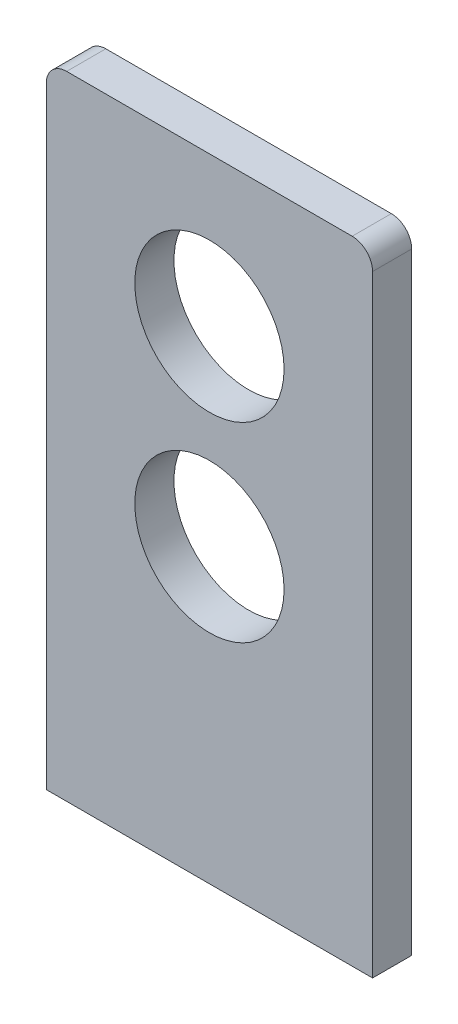
ISO-10303-21;
HEADER;
FILE_DESCRIPTION(('STEP AP214'),'2;1');
FILE_NAME('part.step','',(''),(''),'','','');
FILE_SCHEMA(('AUTOMOTIVE_DESIGN { 1 0 10303 214 1 1 1 1 }'));
ENDSEC;
DATA;
#1=APPLICATION_CONTEXT('core data for automotive mechanical design processes');
#2=APPLICATION_PROTOCOL_DEFINITION('international standard','automotive_design',2000,#1);
#3=PRODUCT_CONTEXT('',#1,'mechanical');
#4=PRODUCT('Part','Part','',(#3));
#5=PRODUCT_RELATED_PRODUCT_CATEGORY('part','',(#4));
#6=PRODUCT_DEFINITION_FORMATION('','',#4);
#7=PRODUCT_DEFINITION_CONTEXT('part definition',#1,'design');
#8=PRODUCT_DEFINITION('design','',#6,#7);
#9=PRODUCT_DEFINITION_SHAPE('','',#8);
#10=(LENGTH_UNIT() NAMED_UNIT(*) SI_UNIT(.MILLI.,.METRE.));
#11=(NAMED_UNIT(*) PLANE_ANGLE_UNIT() SI_UNIT($,.RADIAN.));
#12=(NAMED_UNIT(*) SI_UNIT($,.STERADIAN.) SOLID_ANGLE_UNIT());
#13=UNCERTAINTY_MEASURE_WITH_UNIT(LENGTH_MEASURE(1.E-05),#10,'distance_accuracy_value','');
#14=(GEOMETRIC_REPRESENTATION_CONTEXT(3) GLOBAL_UNCERTAINTY_ASSIGNED_CONTEXT((#13)) GLOBAL_UNIT_ASSIGNED_CONTEXT((#10,
#11,#12)) REPRESENTATION_CONTEXT('',''));
#15=CARTESIAN_POINT('',(0.,0.,0.));
#16=DIRECTION('',(0.,0.,1.));
#17=DIRECTION('',(1.,0.,0.));
#18=AXIS2_PLACEMENT_3D('',#15,#16,#17);
#19=CARTESIAN_POINT('',(-50.8,-120.65,-12.192));
#20=DIRECTION('',(0.,-1.,0.));
#21=DIRECTION('',(0.,0.,-1.));
#22=AXIS2_PLACEMENT_3D('',#19,#20,#21);
#23=PLANE('',#22);
#24=DIRECTION('',(1.,0.,0.));
#25=VECTOR('',#24,1.);
#26=CARTESIAN_POINT('',(-50.8,-120.65,0.));
#27=LINE('',#26,#25);
#28=CARTESIAN_POINT('',(-50.8,-120.65,0.));
#29=VERTEX_POINT('',#28);
#30=CARTESIAN_POINT('',(50.8,-120.65,0.));
#31=VERTEX_POINT('',#30);
#32=EDGE_CURVE('E137',#29,#31,#27,.T.);
#33=ORIENTED_EDGE('',*,*,#32,.F.);
#34=DIRECTION('',(0.,0.,1.));
#35=VECTOR('',#34,1.);
#36=CARTESIAN_POINT('',(-50.8,-120.65,-12.192));
#37=LINE('',#36,#35);
#38=CARTESIAN_POINT('',(-50.8,-120.65,-12.192));
#39=VERTEX_POINT('',#38);
#40=EDGE_CURVE('E54',#39,#29,#37,.T.);
#41=ORIENTED_EDGE('',*,*,#40,.F.);
#42=DIRECTION('',(1.,0.,0.));
#43=VECTOR('',#42,1.);
#44=CARTESIAN_POINT('',(-50.8,-120.65,-12.192));
#45=LINE('',#44,#43);
#46=CARTESIAN_POINT('',(50.8,-120.65,-12.192));
#47=VERTEX_POINT('',#46);
#48=EDGE_CURVE('E117',#39,#47,#45,.T.);
#49=ORIENTED_EDGE('',*,*,#48,.T.);
#50=DIRECTION('',(0.,0.,1.));
#51=VECTOR('',#50,1.);
#52=CARTESIAN_POINT('',(50.8,-120.65,-12.192));
#53=LINE('',#52,#51);
#54=EDGE_CURVE('E11',#47,#31,#53,.T.);
#55=ORIENTED_EDGE('',*,*,#54,.T.);
#56=EDGE_LOOP('',(#33,#41,#49,#55));
#57=FACE_BOUND('',#56,.T.);
#58=ADVANCED_FACE('F44',(#57),#23,.T.);
#59=CARTESIAN_POINT('',(-50.8,-69.85,-12.192));
#60=DIRECTION('',(-1.,0.,0.));
#61=DIRECTION('',(0.,-1.,0.));
#62=AXIS2_PLACEMENT_3D('',#59,#60,#61);
#63=PLANE('',#62);
#64=DIRECTION('',(0.,-1.,0.));
#65=VECTOR('',#64,1.);
#66=CARTESIAN_POINT('',(-50.8,-69.85,0.));
#67=LINE('',#66,#65);
#68=CARTESIAN_POINT('',(-50.8,69.85,0.));
#69=VERTEX_POINT('',#68);
#70=EDGE_CURVE('E103',#69,#29,#67,.T.);
#71=ORIENTED_EDGE('',*,*,#70,.F.);
#72=DIRECTION('',(0.,0.,1.));
#73=VECTOR('',#72,1.);
#74=CARTESIAN_POINT('',(-50.8,69.85,-12.192));
#75=LINE('',#74,#73);
#76=CARTESIAN_POINT('',(-50.8,69.85,-12.192));
#77=VERTEX_POINT('',#76);
#78=EDGE_CURVE('E97',#77,#69,#75,.T.);
#79=ORIENTED_EDGE('',*,*,#78,.F.);
#80=DIRECTION('',(0.,-1.,0.));
#81=VECTOR('',#80,1.);
#82=CARTESIAN_POINT('',(-50.8,69.85,-12.192));
#83=LINE('',#82,#81);
#84=EDGE_CURVE('E105',#77,#39,#83,.T.);
#85=ORIENTED_EDGE('',*,*,#84,.T.);
#86=ORIENTED_EDGE('',*,*,#40,.T.);
#87=EDGE_LOOP('',(#71,#79,#85,#86));
#88=FACE_BOUND('',#87,.T.);
#89=ADVANCED_FACE('F101',(#88),#63,.T.);
#90=CARTESIAN_POINT('',(-44.45,69.85,-12.192));
#91=DIRECTION('',(0.,0.,1.));
#92=DIRECTION('',(1.,0.,0.));
#93=AXIS2_PLACEMENT_3D('',#90,#91,#92);
#94=CYLINDRICAL_SURFACE('',#93,6.34999999999999);
#95=CARTESIAN_POINT('',(-44.45,69.85,0.));
#96=DIRECTION('',(0.,0.,1.));
#97=DIRECTION('',(-1.,0.,0.));
#98=AXIS2_PLACEMENT_3D('',#95,#96,#97);
#99=CIRCLE('',#98,6.34999999999999);
#100=CARTESIAN_POINT('',(-44.45,76.2,0.));
#101=VERTEX_POINT('',#100);
#102=EDGE_CURVE('E138',#101,#69,#99,.T.);
#103=ORIENTED_EDGE('',*,*,#102,.F.);
#104=DIRECTION('',(0.,0.,1.));
#105=VECTOR('',#104,1.);
#106=CARTESIAN_POINT('',(-44.45,76.2,-12.192));
#107=LINE('',#106,#105);
#108=CARTESIAN_POINT('',(-44.45,76.2,-12.192));
#109=VERTEX_POINT('',#108);
#110=EDGE_CURVE('E107',#109,#101,#107,.T.);
#111=ORIENTED_EDGE('',*,*,#110,.F.);
#112=CARTESIAN_POINT('',(-44.45,69.85,-12.192));
#113=DIRECTION('',(0.,0.,1.));
#114=DIRECTION('',(-1.,0.,0.));
#115=AXIS2_PLACEMENT_3D('',#112,#113,#114);
#116=CIRCLE('',#115,6.34999999999999);
#117=EDGE_CURVE('E113',#109,#77,#116,.T.);
#118=ORIENTED_EDGE('',*,*,#117,.T.);
#119=ORIENTED_EDGE('',*,*,#78,.T.);
#120=EDGE_LOOP('',(#103,#111,#118,#119));
#121=FACE_BOUND('',#120,.T.);
#122=ADVANCED_FACE('F119',(#121),#94,.T.);
#123=CARTESIAN_POINT('',(-44.45,76.2,-12.192));
#124=DIRECTION('',(0.,1.,0.));
#125=DIRECTION('',(0.,0.,1.));
#126=AXIS2_PLACEMENT_3D('',#123,#124,#125);
#127=PLANE('',#126);
#128=DIRECTION('',(-1.,0.,0.));
#129=VECTOR('',#128,1.);
#130=CARTESIAN_POINT('',(-44.45,76.2,0.));
#131=LINE('',#130,#129);
#132=CARTESIAN_POINT('',(44.45,76.2,0.));
#133=VERTEX_POINT('',#132);
#134=EDGE_CURVE('E132',#133,#101,#131,.T.);
#135=ORIENTED_EDGE('',*,*,#134,.F.);
#136=DIRECTION('',(0.,0.,1.));
#137=VECTOR('',#136,1.);
#138=CARTESIAN_POINT('',(44.45,76.2,-12.192));
#139=LINE('',#138,#137);
#140=CARTESIAN_POINT('',(44.45,76.2,-12.192));
#141=VERTEX_POINT('',#140);
#142=EDGE_CURVE('E141',#141,#133,#139,.T.);
#143=ORIENTED_EDGE('',*,*,#142,.F.);
#144=DIRECTION('',(-1.,0.,0.));
#145=VECTOR('',#144,1.);
#146=CARTESIAN_POINT('',(-44.45,76.2,-12.192));
#147=LINE('',#146,#145);
#148=EDGE_CURVE('E123',#141,#109,#147,.T.);
#149=ORIENTED_EDGE('',*,*,#148,.T.);
#150=ORIENTED_EDGE('',*,*,#110,.T.);
#151=EDGE_LOOP('',(#135,#143,#149,#150));
#152=FACE_BOUND('',#151,.T.);
#153=ADVANCED_FACE('F167',(#152),#127,.T.);
#154=CARTESIAN_POINT('',(44.45,69.85,-12.192));
#155=DIRECTION('',(0.,0.,1.));
#156=DIRECTION('',(1.,0.,0.));
#157=AXIS2_PLACEMENT_3D('',#154,#155,#156);
#158=CYLINDRICAL_SURFACE('',#157,6.34999999999998);
#159=CARTESIAN_POINT('',(44.45,69.85,0.));
#160=DIRECTION('',(0.,0.,1.));
#161=DIRECTION('',(1.,0.,0.));
#162=AXIS2_PLACEMENT_3D('',#159,#160,#161);
#163=CIRCLE('',#162,6.34999999999998);
#164=CARTESIAN_POINT('',(50.8,69.85,0.));
#165=VERTEX_POINT('',#164);
#166=EDGE_CURVE('E129',#165,#133,#163,.T.);
#167=ORIENTED_EDGE('',*,*,#166,.F.);
#168=DIRECTION('',(0.,0.,1.));
#169=VECTOR('',#168,1.);
#170=CARTESIAN_POINT('',(50.8,69.85,-12.192));
#171=LINE('',#170,#169);
#172=CARTESIAN_POINT('',(50.8,69.85,-12.192));
#173=VERTEX_POINT('',#172);
#174=EDGE_CURVE('E47',#173,#165,#171,.T.);
#175=ORIENTED_EDGE('',*,*,#174,.F.);
#176=CARTESIAN_POINT('',(44.45,69.85,-12.192));
#177=DIRECTION('',(0.,0.,1.));
#178=DIRECTION('',(1.,0.,0.));
#179=AXIS2_PLACEMENT_3D('',#176,#177,#178);
#180=CIRCLE('',#179,6.34999999999998);
#181=EDGE_CURVE('E121',#173,#141,#180,.T.);
#182=ORIENTED_EDGE('',*,*,#181,.T.);
#183=ORIENTED_EDGE('',*,*,#142,.T.);
#184=EDGE_LOOP('',(#167,#175,#182,#183));
#185=FACE_BOUND('',#184,.T.);
#186=ADVANCED_FACE('F149',(#185),#158,.T.);
#187=CARTESIAN_POINT('',(50.8,69.85,-12.192));
#188=DIRECTION('',(1.,0.,0.));
#189=DIRECTION('',(0.,1.,0.));
#190=AXIS2_PLACEMENT_3D('',#187,#188,#189);
#191=PLANE('',#190);
#192=DIRECTION('',(0.,1.,0.));
#193=VECTOR('',#192,1.);
#194=CARTESIAN_POINT('',(50.8,69.85,0.));
#195=LINE('',#194,#193);
#196=EDGE_CURVE('E87',#31,#165,#195,.T.);
#197=ORIENTED_EDGE('',*,*,#196,.F.);
#198=ORIENTED_EDGE('',*,*,#54,.F.);
#199=DIRECTION('',(0.,1.,0.));
#200=VECTOR('',#199,1.);
#201=CARTESIAN_POINT('',(50.8,-69.85,-12.192));
#202=LINE('',#201,#200);
#203=EDGE_CURVE('E89',#47,#173,#202,.T.);
#204=ORIENTED_EDGE('',*,*,#203,.T.);
#205=ORIENTED_EDGE('',*,*,#174,.T.);
#206=EDGE_LOOP('',(#197,#198,#204,#205));
#207=FACE_BOUND('',#206,.T.);
#208=ADVANCED_FACE('F50',(#207),#191,.T.);
#209=CARTESIAN_POINT('',(-44.45,69.85,-12.192));
#210=DIRECTION('',(0.,0.,-1.));
#211=DIRECTION('',(-1.,0.,0.));
#212=AXIS2_PLACEMENT_3D('',#209,#210,#211);
#213=PLANE('',#212);
#214=CARTESIAN_POINT('',(0.,-29.718,-12.192));
#215=DIRECTION('',(0.,0.,1.));
#216=DIRECTION('',(1.,0.,0.));
#217=AXIS2_PLACEMENT_3D('',#214,#215,#216);
#218=CIRCLE('',#217,23.241);
#219=CARTESIAN_POINT('',(23.241,-29.718,-12.192));
#220=VERTEX_POINT('',#219);
#221=EDGE_CURVE('E195',#220,#220,#218,.T.);
#222=ORIENTED_EDGE('',*,*,#221,.T.);
#223=EDGE_LOOP('',(#222));
#224=FACE_BOUND('',#223,.T.);
#225=CARTESIAN_POINT('',(0.,29.718,-12.192));
#226=DIRECTION('',(0.,0.,1.));
#227=DIRECTION('',(1.,0.,0.));
#228=AXIS2_PLACEMENT_3D('',#225,#226,#227);
#229=CIRCLE('',#228,23.241);
#230=CARTESIAN_POINT('',(23.241,29.718,-12.192));
#231=VERTEX_POINT('',#230);
#232=EDGE_CURVE('E128',#231,#231,#229,.T.);
#233=ORIENTED_EDGE('',*,*,#232,.T.);
#234=EDGE_LOOP('',(#233));
#235=FACE_BOUND('',#234,.T.);
#236=ORIENTED_EDGE('',*,*,#203,.F.);
#237=ORIENTED_EDGE('',*,*,#48,.F.);
#238=ORIENTED_EDGE('',*,*,#84,.F.);
#239=ORIENTED_EDGE('',*,*,#117,.F.);
#240=ORIENTED_EDGE('',*,*,#148,.F.);
#241=ORIENTED_EDGE('',*,*,#181,.F.);
#242=EDGE_LOOP('',(#236,#237,#238,#239,#240,#241));
#243=FACE_BOUND('',#242,.T.);
#244=ADVANCED_FACE('F114',(#224,#235,#243),#213,.T.);
#245=CARTESIAN_POINT('',(-44.45,69.85,0.));
#246=DIRECTION('',(0.,0.,-1.));
#247=DIRECTION('',(-1.,0.,0.));
#248=AXIS2_PLACEMENT_3D('',#245,#246,#247);
#249=PLANE('',#248);
#250=CARTESIAN_POINT('',(0.,-29.718,0.));
#251=DIRECTION('',(0.,0.,1.));
#252=DIRECTION('',(1.,0.,0.));
#253=AXIS2_PLACEMENT_3D('',#250,#251,#252);
#254=CIRCLE('',#253,23.241);
#255=CARTESIAN_POINT('',(23.241,-29.718,0.));
#256=VERTEX_POINT('',#255);
#257=EDGE_CURVE('E194',#256,#256,#254,.T.);
#258=ORIENTED_EDGE('',*,*,#257,.F.);
#259=EDGE_LOOP('',(#258));
#260=FACE_BOUND('',#259,.T.);
#261=CARTESIAN_POINT('',(0.,29.718,0.));
#262=DIRECTION('',(0.,0.,1.));
#263=DIRECTION('',(1.,0.,0.));
#264=AXIS2_PLACEMENT_3D('',#261,#262,#263);
#265=CIRCLE('',#264,23.241);
#266=CARTESIAN_POINT('',(23.241,29.718,0.));
#267=VERTEX_POINT('',#266);
#268=EDGE_CURVE('E197',#267,#267,#265,.T.);
#269=ORIENTED_EDGE('',*,*,#268,.F.);
#270=EDGE_LOOP('',(#269));
#271=FACE_BOUND('',#270,.T.);
#272=ORIENTED_EDGE('',*,*,#32,.T.);
#273=ORIENTED_EDGE('',*,*,#196,.T.);
#274=ORIENTED_EDGE('',*,*,#166,.T.);
#275=ORIENTED_EDGE('',*,*,#134,.T.);
#276=ORIENTED_EDGE('',*,*,#102,.T.);
#277=ORIENTED_EDGE('',*,*,#70,.T.);
#278=EDGE_LOOP('',(#272,#273,#274,#275,#276,#277));
#279=FACE_BOUND('',#278,.T.);
#280=ADVANCED_FACE('F151',(#260,#271,#279),#249,.F.);
#281=CARTESIAN_POINT('',(0.,29.718,-12.192));
#282=DIRECTION('',(0.,0.,1.));
#283=DIRECTION('',(1.,0.,0.));
#284=AXIS2_PLACEMENT_3D('',#281,#282,#283);
#285=CYLINDRICAL_SURFACE('',#284,23.241);
#286=CARTESIAN_POINT('',(23.241,29.718,-12.192));
#287=CARTESIAN_POINT('',(23.241,29.718,-12.065));
#288=CARTESIAN_POINT('',(23.241,29.718,-11.938));
#289=CARTESIAN_POINT('',(23.241,29.718,-11.684));
#290=CARTESIAN_POINT('',(23.241,29.718,-11.557));
#291=CARTESIAN_POINT('',(23.241,29.718,-11.303));
#292=CARTESIAN_POINT('',(23.241,29.718,-11.176));
#293=CARTESIAN_POINT('',(23.241,29.718,-10.922));
#294=CARTESIAN_POINT('',(23.241,29.718,-10.795));
#295=CARTESIAN_POINT('',(23.241,29.718,-10.541));
#296=CARTESIAN_POINT('',(23.241,29.718,-10.414));
#297=CARTESIAN_POINT('',(23.241,29.718,-10.16));
#298=CARTESIAN_POINT('',(23.241,29.718,-10.033));
#299=CARTESIAN_POINT('',(23.241,29.718,-9.779));
#300=CARTESIAN_POINT('',(23.241,29.718,-9.652));
#301=CARTESIAN_POINT('',(23.241,29.718,-9.398));
#302=CARTESIAN_POINT('',(23.241,29.718,-9.271));
#303=CARTESIAN_POINT('',(23.241,29.718,-9.017));
#304=CARTESIAN_POINT('',(23.241,29.718,-8.89));
#305=CARTESIAN_POINT('',(23.241,29.718,-8.636));
#306=CARTESIAN_POINT('',(23.241,29.718,-8.509));
#307=CARTESIAN_POINT('',(23.241,29.718,-8.255));
#308=CARTESIAN_POINT('',(23.241,29.718,-8.128));
#309=CARTESIAN_POINT('',(23.241,29.718,-7.874));
#310=CARTESIAN_POINT('',(23.241,29.718,-7.747));
#311=CARTESIAN_POINT('',(23.241,29.718,-7.493));
#312=CARTESIAN_POINT('',(23.241,29.718,-7.366));
#313=CARTESIAN_POINT('',(23.241,29.718,-7.112));
#314=CARTESIAN_POINT('',(23.241,29.718,-6.985));
#315=CARTESIAN_POINT('',(23.241,29.718,-6.731));
#316=CARTESIAN_POINT('',(23.241,29.718,-6.604));
#317=CARTESIAN_POINT('',(23.241,29.718,-6.35));
#318=CARTESIAN_POINT('',(23.241,29.718,-6.223));
#319=CARTESIAN_POINT('',(23.241,29.718,-5.969));
#320=CARTESIAN_POINT('',(23.241,29.718,-5.842));
#321=CARTESIAN_POINT('',(23.241,29.718,-5.588));
#322=CARTESIAN_POINT('',(23.241,29.718,-5.461));
#323=CARTESIAN_POINT('',(23.241,29.718,-5.207));
#324=CARTESIAN_POINT('',(23.241,29.718,-5.08));
#325=CARTESIAN_POINT('',(23.241,29.718,-4.826));
#326=CARTESIAN_POINT('',(23.241,29.718,-4.699));
#327=CARTESIAN_POINT('',(23.241,29.718,-4.445));
#328=CARTESIAN_POINT('',(23.241,29.718,-4.318));
#329=CARTESIAN_POINT('',(23.241,29.718,-4.064));
#330=CARTESIAN_POINT('',(23.241,29.718,-3.937));
#331=CARTESIAN_POINT('',(23.241,29.718,-3.683));
#332=CARTESIAN_POINT('',(23.241,29.718,-3.556));
#333=CARTESIAN_POINT('',(23.241,29.718,-3.302));
#334=CARTESIAN_POINT('',(23.241,29.718,-3.175));
#335=CARTESIAN_POINT('',(23.241,29.718,-2.921));
#336=CARTESIAN_POINT('',(23.241,29.718,-2.794));
#337=CARTESIAN_POINT('',(23.241,29.718,-2.54));
#338=CARTESIAN_POINT('',(23.241,29.718,-2.413));
#339=CARTESIAN_POINT('',(23.241,29.718,-2.159));
#340=CARTESIAN_POINT('',(23.241,29.718,-2.032));
#341=CARTESIAN_POINT('',(23.241,29.718,-1.778));
#342=CARTESIAN_POINT('',(23.241,29.718,-1.651));
#343=CARTESIAN_POINT('',(23.241,29.718,-1.397));
#344=CARTESIAN_POINT('',(23.241,29.718,-1.27));
#345=CARTESIAN_POINT('',(23.241,29.718,-1.016));
#346=CARTESIAN_POINT('',(23.241,29.718,-0.889));
#347=CARTESIAN_POINT('',(23.241,29.718,-0.635));
#348=CARTESIAN_POINT('',(23.241,29.718,-0.508));
#349=CARTESIAN_POINT('',(23.241,29.718,-0.254));
#350=CARTESIAN_POINT('',(23.241,29.718,-0.127));
#351=CARTESIAN_POINT('',(23.241,29.718,0.));
#352=B_SPLINE_CURVE_WITH_KNOTS('',3,(#286,#287,#288,#289,#290,#291,#292,#293,#294,#295,#296,
#297,#298,#299,#300,#301,#302,#303,#304,#305,#306,#307,#308,#309,#310,#311,#312,#313,#314,#315,
#316,#317,#318,#319,#320,#321,#322,#323,#324,#325,#326,#327,#328,#329,#330,#331,#332,#333,#334,
#335,#336,#337,#338,#339,#340,#341,#342,#343,#344,#345,#346,#347,#348,#349,#350,#351),
.UNSPECIFIED.,.F.,.F.,(4,2,2,2,2,2,2,2,2,2,2,2,2,2,2,2,2,2,2,2,2,2,2,2,2,2,2,2,2,2,2,2,4),(0.,
0.380999999999999,0.761999999999999,1.143,1.524,1.905,2.286,2.667,3.048,3.429,3.81,4.191,4.572,
4.953,5.334,5.715,6.096,6.477,6.858,7.239,7.62,8.001,8.382,8.763,9.144,9.525,9.906,10.287,
10.668,11.049,11.43,11.811,12.192),.UNSPECIFIED.);
#353=EDGE_CURVE('BSEAM177',#231,#267,#352,.T.);
#354=ORIENTED_EDGE('',*,*,#232,.F.);
#355=ORIENTED_EDGE('',*,*,#268,.T.);
#356=ORIENTED_EDGE('',*,*,#353,.T.);
#357=ORIENTED_EDGE('',*,*,#353,.F.);
#358=EDGE_LOOP('',(#354,#356,#355,#357));
#359=FACE_BOUND('',#358,.T.);
#360=ADVANCED_FACE('F177',(#359),#285,.F.);
#361=CARTESIAN_POINT('',(0.,-29.718,-12.192));
#362=DIRECTION('',(0.,0.,1.));
#363=DIRECTION('',(1.,0.,0.));
#364=AXIS2_PLACEMENT_3D('',#361,#362,#363);
#365=CYLINDRICAL_SURFACE('',#364,23.241);
#366=CARTESIAN_POINT('',(23.241,-29.718,-12.192));
#367=CARTESIAN_POINT('',(23.241,-29.718,-12.065));
#368=CARTESIAN_POINT('',(23.241,-29.718,-11.938));
#369=CARTESIAN_POINT('',(23.241,-29.718,-11.684));
#370=CARTESIAN_POINT('',(23.241,-29.718,-11.557));
#371=CARTESIAN_POINT('',(23.241,-29.718,-11.303));
#372=CARTESIAN_POINT('',(23.241,-29.718,-11.176));
#373=CARTESIAN_POINT('',(23.241,-29.718,-10.922));
#374=CARTESIAN_POINT('',(23.241,-29.718,-10.795));
#375=CARTESIAN_POINT('',(23.241,-29.718,-10.541));
#376=CARTESIAN_POINT('',(23.241,-29.718,-10.414));
#377=CARTESIAN_POINT('',(23.241,-29.718,-10.16));
#378=CARTESIAN_POINT('',(23.241,-29.718,-10.033));
#379=CARTESIAN_POINT('',(23.241,-29.718,-9.779));
#380=CARTESIAN_POINT('',(23.241,-29.718,-9.652));
#381=CARTESIAN_POINT('',(23.241,-29.718,-9.398));
#382=CARTESIAN_POINT('',(23.241,-29.718,-9.271));
#383=CARTESIAN_POINT('',(23.241,-29.718,-9.017));
#384=CARTESIAN_POINT('',(23.241,-29.718,-8.89));
#385=CARTESIAN_POINT('',(23.241,-29.718,-8.636));
#386=CARTESIAN_POINT('',(23.241,-29.718,-8.509));
#387=CARTESIAN_POINT('',(23.241,-29.718,-8.255));
#388=CARTESIAN_POINT('',(23.241,-29.718,-8.128));
#389=CARTESIAN_POINT('',(23.241,-29.718,-7.874));
#390=CARTESIAN_POINT('',(23.241,-29.718,-7.747));
#391=CARTESIAN_POINT('',(23.241,-29.718,-7.493));
#392=CARTESIAN_POINT('',(23.241,-29.718,-7.366));
#393=CARTESIAN_POINT('',(23.241,-29.718,-7.112));
#394=CARTESIAN_POINT('',(23.241,-29.718,-6.985));
#395=CARTESIAN_POINT('',(23.241,-29.718,-6.731));
#396=CARTESIAN_POINT('',(23.241,-29.718,-6.604));
#397=CARTESIAN_POINT('',(23.241,-29.718,-6.35));
#398=CARTESIAN_POINT('',(23.241,-29.718,-6.223));
#399=CARTESIAN_POINT('',(23.241,-29.718,-5.969));
#400=CARTESIAN_POINT('',(23.241,-29.718,-5.842));
#401=CARTESIAN_POINT('',(23.241,-29.718,-5.588));
#402=CARTESIAN_POINT('',(23.241,-29.718,-5.461));
#403=CARTESIAN_POINT('',(23.241,-29.718,-5.207));
#404=CARTESIAN_POINT('',(23.241,-29.718,-5.08));
#405=CARTESIAN_POINT('',(23.241,-29.718,-4.826));
#406=CARTESIAN_POINT('',(23.241,-29.718,-4.699));
#407=CARTESIAN_POINT('',(23.241,-29.718,-4.445));
#408=CARTESIAN_POINT('',(23.241,-29.718,-4.318));
#409=CARTESIAN_POINT('',(23.241,-29.718,-4.064));
#410=CARTESIAN_POINT('',(23.241,-29.718,-3.937));
#411=CARTESIAN_POINT('',(23.241,-29.718,-3.683));
#412=CARTESIAN_POINT('',(23.241,-29.718,-3.556));
#413=CARTESIAN_POINT('',(23.241,-29.718,-3.302));
#414=CARTESIAN_POINT('',(23.241,-29.718,-3.175));
#415=CARTESIAN_POINT('',(23.241,-29.718,-2.921));
#416=CARTESIAN_POINT('',(23.241,-29.718,-2.794));
#417=CARTESIAN_POINT('',(23.241,-29.718,-2.54));
#418=CARTESIAN_POINT('',(23.241,-29.718,-2.413));
#419=CARTESIAN_POINT('',(23.241,-29.718,-2.159));
#420=CARTESIAN_POINT('',(23.241,-29.718,-2.032));
#421=CARTESIAN_POINT('',(23.241,-29.718,-1.778));
#422=CARTESIAN_POINT('',(23.241,-29.718,-1.651));
#423=CARTESIAN_POINT('',(23.241,-29.718,-1.397));
#424=CARTESIAN_POINT('',(23.241,-29.718,-1.27));
#425=CARTESIAN_POINT('',(23.241,-29.718,-1.016));
#426=CARTESIAN_POINT('',(23.241,-29.718,-0.889));
#427=CARTESIAN_POINT('',(23.241,-29.718,-0.635));
#428=CARTESIAN_POINT('',(23.241,-29.718,-0.508));
#429=CARTESIAN_POINT('',(23.241,-29.718,-0.254));
#430=CARTESIAN_POINT('',(23.241,-29.718,-0.127));
#431=CARTESIAN_POINT('',(23.241,-29.718,0.));
#432=B_SPLINE_CURVE_WITH_KNOTS('',3,(#366,#367,#368,#369,#370,#371,#372,#373,#374,#375,#376,
#377,#378,#379,#380,#381,#382,#383,#384,#385,#386,#387,#388,#389,#390,#391,#392,#393,#394,#395,
#396,#397,#398,#399,#400,#401,#402,#403,#404,#405,#406,#407,#408,#409,#410,#411,#412,#413,#414,
#415,#416,#417,#418,#419,#420,#421,#422,#423,#424,#425,#426,#427,#428,#429,#430,#431),
.UNSPECIFIED.,.F.,.F.,(4,2,2,2,2,2,2,2,2,2,2,2,2,2,2,2,2,2,2,2,2,2,2,2,2,2,2,2,2,2,2,2,4),(0.,
0.380999999999999,0.761999999999999,1.143,1.524,1.905,2.286,2.667,3.048,3.429,3.81,4.191,4.572,
4.953,5.334,5.715,6.096,6.477,6.858,7.239,7.62,8.001,8.382,8.763,9.144,9.525,9.906,10.287,
10.668,11.049,11.43,11.811,12.192),.UNSPECIFIED.);
#433=EDGE_CURVE('BSEAM183',#220,#256,#432,.T.);
#434=ORIENTED_EDGE('',*,*,#221,.F.);
#435=ORIENTED_EDGE('',*,*,#257,.T.);
#436=ORIENTED_EDGE('',*,*,#433,.T.);
#437=ORIENTED_EDGE('',*,*,#433,.F.);
#438=EDGE_LOOP('',(#434,#436,#435,#437));
#439=FACE_BOUND('',#438,.T.);
#440=ADVANCED_FACE('F183',(#439),#365,.F.);
#441=CLOSED_SHELL('',(#58,#89,#122,#153,#186,#208,#244,#280,#360,#440));
#442=MANIFOLD_SOLID_BREP('B2',#441);
#443=ADVANCED_BREP_SHAPE_REPRESENTATION('',(#18,#442),#14);
#444=SHAPE_DEFINITION_REPRESENTATION(#9,#443);
ENDSEC;
END-ISO-10303-21;
